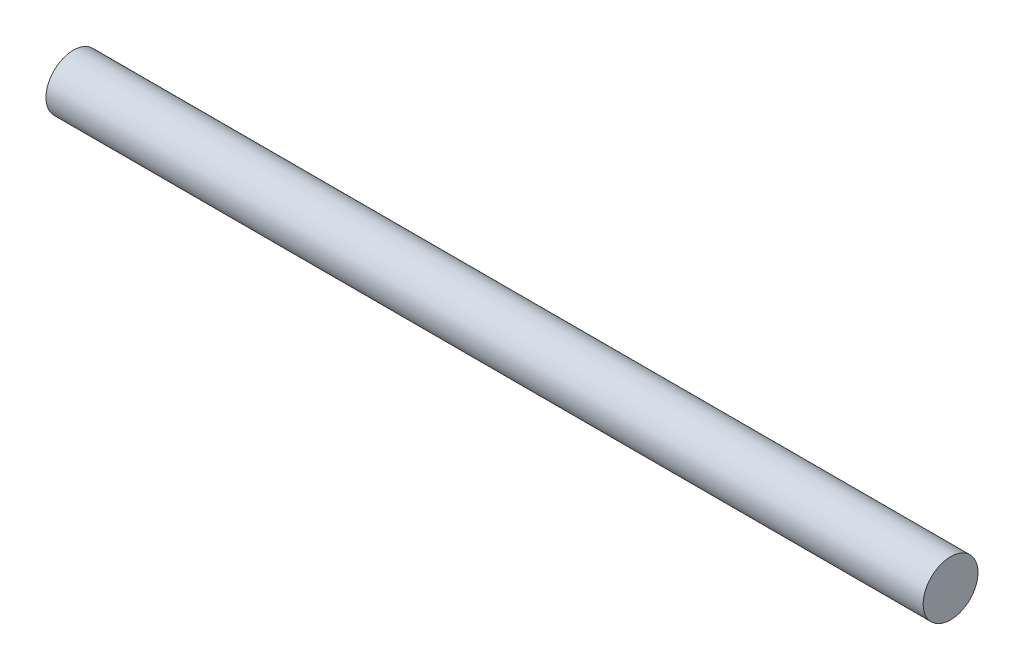
ISO-10303-21;
HEADER;
FILE_DESCRIPTION(('STEP AP214'),'2;1');
FILE_NAME('part.step','',(''),(''),'','','');
FILE_SCHEMA(('AUTOMOTIVE_DESIGN { 1 0 10303 214 1 1 1 1 }'));
ENDSEC;
DATA;
#1=APPLICATION_CONTEXT('core data for automotive mechanical design processes');
#2=APPLICATION_PROTOCOL_DEFINITION('international standard','automotive_design',2000,#1);
#3=PRODUCT_CONTEXT('',#1,'mechanical');
#4=PRODUCT('Part','Part','',(#3));
#5=PRODUCT_RELATED_PRODUCT_CATEGORY('part','',(#4));
#6=PRODUCT_DEFINITION_FORMATION('','',#4);
#7=PRODUCT_DEFINITION_CONTEXT('part definition',#1,'design');
#8=PRODUCT_DEFINITION('design','',#6,#7);
#9=PRODUCT_DEFINITION_SHAPE('','',#8);
#10=(LENGTH_UNIT() NAMED_UNIT(*) SI_UNIT(.MILLI.,.METRE.));
#11=(NAMED_UNIT(*) PLANE_ANGLE_UNIT() SI_UNIT($,.RADIAN.));
#12=(NAMED_UNIT(*) SI_UNIT($,.STERADIAN.) SOLID_ANGLE_UNIT());
#13=UNCERTAINTY_MEASURE_WITH_UNIT(LENGTH_MEASURE(1.E-05),#10,'distance_accuracy_value','');
#14=(GEOMETRIC_REPRESENTATION_CONTEXT(3) GLOBAL_UNCERTAINTY_ASSIGNED_CONTEXT((#13)) GLOBAL_UNIT_ASSIGNED_CONTEXT((#10,
#11,#12)) REPRESENTATION_CONTEXT('',''));
#15=CARTESIAN_POINT('',(0.,0.,0.));
#16=DIRECTION('',(0.,0.,1.));
#17=DIRECTION('',(1.,0.,0.));
#18=AXIS2_PLACEMENT_3D('',#15,#16,#17);
#19=CARTESIAN_POINT('',(20.,0.,0.));
#20=DIRECTION('',(-1.,0.,0.));
#21=DIRECTION('',(0.,0.,1.));
#22=AXIS2_PLACEMENT_3D('',#19,#20,#21);
#23=CYLINDRICAL_SURFACE('',#22,1.25);
#24=CARTESIAN_POINT('',(20.,0.,0.));
#25=DIRECTION('',(1.,0.,0.));
#26=DIRECTION('',(0.,0.,-1.));
#27=AXIS2_PLACEMENT_3D('',#24,#25,#26);
#28=CIRCLE('',#27,1.25);
#29=CARTESIAN_POINT('',(20.,0.,-1.25));
#30=VERTEX_POINT('',#29);
#31=EDGE_CURVE('E10',#30,#30,#28,.T.);
#32=ORIENTED_EDGE('',*,*,#31,.F.);
#33=EDGE_LOOP('',(#32));
#34=FACE_BOUND('',#33,.T.);
#35=CARTESIAN_POINT('',(-20.,0.,0.));
#36=DIRECTION('',(1.,0.,0.));
#37=DIRECTION('',(0.,0.,-1.));
#38=AXIS2_PLACEMENT_3D('',#35,#36,#37);
#39=CIRCLE('',#38,1.25);
#40=CARTESIAN_POINT('',(-20.,0.,-1.25));
#41=VERTEX_POINT('',#40);
#42=EDGE_CURVE('E35',#41,#41,#39,.T.);
#43=ORIENTED_EDGE('',*,*,#42,.T.);
#44=EDGE_LOOP('',(#43));
#45=FACE_BOUND('',#44,.T.);
#46=ADVANCED_FACE('F32',(#34,#45),#23,.T.);
#47=CARTESIAN_POINT('',(20.,0.,0.));
#48=DIRECTION('',(1.,0.,0.));
#49=DIRECTION('',(0.,0.,-1.));
#50=AXIS2_PLACEMENT_3D('',#47,#48,#49);
#51=PLANE('',#50);
#52=ORIENTED_EDGE('',*,*,#31,.T.);
#53=EDGE_LOOP('',(#52));
#54=FACE_BOUND('',#53,.T.);
#55=ADVANCED_FACE('F47',(#54),#51,.T.);
#56=CARTESIAN_POINT('',(-20.,0.,0.));
#57=DIRECTION('',(1.,0.,0.));
#58=DIRECTION('',(0.,0.,-1.));
#59=AXIS2_PLACEMENT_3D('',#56,#57,#58);
#60=PLANE('',#59);
#61=ORIENTED_EDGE('',*,*,#42,.F.);
#62=EDGE_LOOP('',(#61));
#63=FACE_BOUND('',#62,.T.);
#64=ADVANCED_FACE('F45',(#63),#60,.F.);
#65=CLOSED_SHELL('',(#46,#55,#64));
#66=MANIFOLD_SOLID_BREP('B2',#65);
#67=ADVANCED_BREP_SHAPE_REPRESENTATION('',(#18,#66),#14);
#68=SHAPE_DEFINITION_REPRESENTATION(#9,#67);
ENDSEC;
END-ISO-10303-21;
